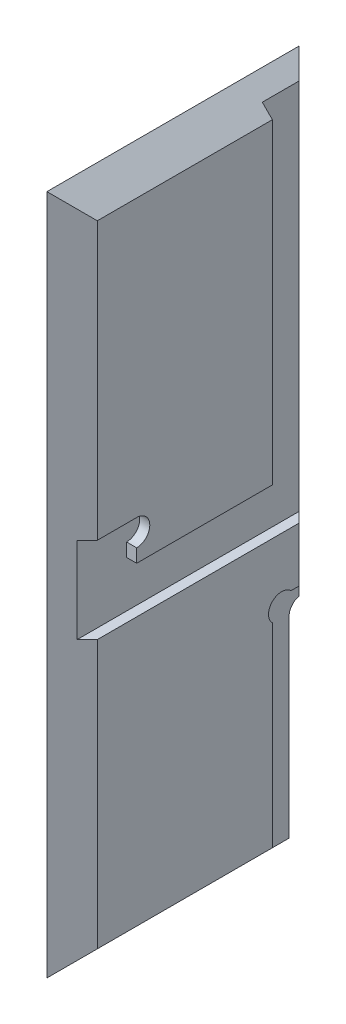
ISO-10303-21;
HEADER;
FILE_DESCRIPTION(('STEP AP214'),'2;1');
FILE_NAME('part.step','',(''),(''),'','','');
FILE_SCHEMA(('AUTOMOTIVE_DESIGN { 1 0 10303 214 1 1 1 1 }'));
ENDSEC;
DATA;
#1=APPLICATION_CONTEXT('core data for automotive mechanical design processes');
#2=APPLICATION_PROTOCOL_DEFINITION('international standard','automotive_design',2000,#1);
#3=PRODUCT_CONTEXT('',#1,'mechanical');
#4=PRODUCT('Part','Part','',(#3));
#5=PRODUCT_RELATED_PRODUCT_CATEGORY('part','',(#4));
#6=PRODUCT_DEFINITION_FORMATION('','',#4);
#7=PRODUCT_DEFINITION_CONTEXT('part definition',#1,'design');
#8=PRODUCT_DEFINITION('design','',#6,#7);
#9=PRODUCT_DEFINITION_SHAPE('','',#8);
#10=(LENGTH_UNIT() NAMED_UNIT(*) SI_UNIT(.MILLI.,.METRE.));
#11=(NAMED_UNIT(*) PLANE_ANGLE_UNIT() SI_UNIT($,.RADIAN.));
#12=(NAMED_UNIT(*) SI_UNIT($,.STERADIAN.) SOLID_ANGLE_UNIT());
#13=UNCERTAINTY_MEASURE_WITH_UNIT(LENGTH_MEASURE(1.E-05),#10,'distance_accuracy_value','');
#14=(GEOMETRIC_REPRESENTATION_CONTEXT(3) GLOBAL_UNCERTAINTY_ASSIGNED_CONTEXT((#13)) GLOBAL_UNIT_ASSIGNED_CONTEXT((#10,
#11,#12)) REPRESENTATION_CONTEXT('',''));
#15=CARTESIAN_POINT('',(0.,0.,0.));
#16=DIRECTION('',(0.,0.,1.));
#17=DIRECTION('',(1.,0.,0.));
#18=AXIS2_PLACEMENT_3D('',#15,#16,#17);
#19=CARTESIAN_POINT('',(0.,171.45,63.4999999999994));
#20=DIRECTION('',(0.707106781186549,0.,0.707106781186546));
#21=DIRECTION('',(0.707106781186546,0.,-0.707106781186549));
#22=AXIS2_PLACEMENT_3D('',#19,#20,#21);
#23=PLANE('',#22);
#24=DIRECTION('',(-0.707106781186546,0.,0.707106781186549));
#25=VECTOR('',#24,1.);
#26=CARTESIAN_POINT('',(0.,-23.876,63.4999999999994));
#27=LINE('',#26,#25);
#28=CARTESIAN_POINT('',(7.62,-23.876,55.8799999999994));
#29=VERTEX_POINT('',#28);
#30=CARTESIAN_POINT('',(12.7,-23.876,50.7999999999994));
#31=VERTEX_POINT('',#30);
#32=EDGE_CURVE('E298',#29,#31,#27,.F.);
#33=ORIENTED_EDGE('',*,*,#32,.F.);
#34=DIRECTION('',(0.,-1.,0.));
#35=VECTOR('',#34,1.);
#36=CARTESIAN_POINT('',(7.62,171.45,55.8799999999994));
#37=LINE('',#36,#35);
#38=CARTESIAN_POINT('',(7.62,19.431,55.8799999999994));
#39=VERTEX_POINT('',#38);
#40=EDGE_CURVE('E300',#29,#39,#37,.F.);
#41=ORIENTED_EDGE('',*,*,#40,.T.);
#42=DIRECTION('',(0.707106781186546,0.,-0.707106781186549));
#43=VECTOR('',#42,1.);
#44=CARTESIAN_POINT('',(0.,19.431,63.4999999999994));
#45=LINE('',#44,#43);
#46=CARTESIAN_POINT('',(12.7,19.431,50.7999999999994));
#47=VERTEX_POINT('',#46);
#48=EDGE_CURVE('E294',#47,#39,#45,.F.);
#49=ORIENTED_EDGE('',*,*,#48,.F.);
#50=DIRECTION('',(0.,1.,0.));
#51=VECTOR('',#50,1.);
#52=CARTESIAN_POINT('',(12.7,171.45,50.7999999999994));
#53=LINE('',#52,#51);
#54=CARTESIAN_POINT('',(12.7,158.75,50.7999999999994));
#55=VERTEX_POINT('',#54);
#56=EDGE_CURVE('E325',#55,#47,#53,.F.);
#57=ORIENTED_EDGE('',*,*,#56,.F.);
#58=DIRECTION('',(-0.577350269189624,0.577350269189627,0.577350269189627));
#59=VECTOR('',#58,1.);
#60=CARTESIAN_POINT('',(0.,171.45,63.4999999999994));
#61=LINE('',#60,#59);
#62=CARTESIAN_POINT('',(0.,171.45,63.4999999999994));
#63=VERTEX_POINT('',#62);
#64=EDGE_CURVE('E317',#55,#63,#61,.T.);
#65=ORIENTED_EDGE('',*,*,#64,.T.);
#66=DIRECTION('',(0.,-1.,0.));
#67=VECTOR('',#66,1.);
#68=CARTESIAN_POINT('',(0.,171.45,63.4999999999994));
#69=LINE('',#68,#67);
#70=CARTESIAN_POINT('',(0.,-171.45,63.4999999999994));
#71=VERTEX_POINT('',#70);
#72=EDGE_CURVE('E303',#63,#71,#69,.T.);
#73=ORIENTED_EDGE('',*,*,#72,.T.);
#74=DIRECTION('',(-0.577350269189624,-0.577350269189627,0.577350269189626));
#75=VECTOR('',#74,1.);
#76=CARTESIAN_POINT('',(0.,-171.45,63.4999999999994));
#77=LINE('',#76,#75);
#78=CARTESIAN_POINT('',(12.7,-158.75,50.7999999999994));
#79=VERTEX_POINT('',#78);
#80=EDGE_CURVE('E208',#79,#71,#77,.T.);
#81=ORIENTED_EDGE('',*,*,#80,.F.);
#82=EDGE_CURVE('E312',#31,#79,#53,.F.);
#83=ORIENTED_EDGE('',*,*,#82,.F.);
#84=EDGE_LOOP('',(#33,#41,#49,#57,#65,#73,#81,#83));
#85=FACE_BOUND('',#84,.T.);
#86=ADVANCED_FACE('F39',(#85),#23,.T.);
#87=CARTESIAN_POINT('',(0.,171.45,-63.4999999999995));
#88=DIRECTION('',(0.707106781186549,0.,-0.707106781186546));
#89=DIRECTION('',(-0.707106781186546,0.,-0.707106781186549));
#90=AXIS2_PLACEMENT_3D('',#87,#88,#89);
#91=PLANE('',#90);
#92=DIRECTION('',(-0.577350269189624,0.577350269189627,-0.577350269189626));
#93=VECTOR('',#92,1.);
#94=CARTESIAN_POINT('',(42.3333333333329,129.116666666667,-21.1666666666665));
#95=LINE('',#94,#93);
#96=CARTESIAN_POINT('',(7.61999999999999,163.83,-55.8799999999995));
#97=VERTEX_POINT('',#96);
#98=CARTESIAN_POINT('',(0.,171.45,-63.4999999999995));
#99=VERTEX_POINT('',#98);
#100=EDGE_CURVE('E315',#97,#99,#95,.T.);
#101=ORIENTED_EDGE('',*,*,#100,.F.);
#102=DIRECTION('',(0.,1.,0.));
#103=VECTOR('',#102,1.);
#104=CARTESIAN_POINT('',(7.62,171.45,-55.8799999999995));
#105=LINE('',#104,#103);
#106=CARTESIAN_POINT('',(7.62,-23.876,-55.8799999999995));
#107=VERTEX_POINT('',#106);
#108=EDGE_CURVE('E196',#97,#107,#105,.F.);
#109=ORIENTED_EDGE('',*,*,#108,.T.);
#110=DIRECTION('',(0.707106781186546,0.,0.707106781186549));
#111=VECTOR('',#110,1.);
#112=CARTESIAN_POINT('',(0.,-23.876,-63.4999999999995));
#113=LINE('',#112,#111);
#114=CARTESIAN_POINT('',(12.7,-23.876,-50.7999999999995));
#115=VERTEX_POINT('',#114);
#116=EDGE_CURVE('E296',#115,#107,#113,.F.);
#117=ORIENTED_EDGE('',*,*,#116,.F.);
#118=DIRECTION('',(0.,-1.,0.));
#119=VECTOR('',#118,1.);
#120=CARTESIAN_POINT('',(12.7,171.45,-50.7999999999995));
#121=LINE('',#120,#119);
#122=CARTESIAN_POINT('',(12.7,-51.3079999999997,-50.7999999999995));
#123=VERTEX_POINT('',#122);
#124=EDGE_CURVE('E324',#123,#115,#121,.F.);
#125=ORIENTED_EDGE('',*,*,#124,.F.);
#126=DIRECTION('',(0.707106781186546,0.,0.707106781186549));
#127=VECTOR('',#126,1.);
#128=CARTESIAN_POINT('',(0.,-51.3079999999997,-63.4999999999995));
#129=LINE('',#128,#127);
#130=CARTESIAN_POINT('',(7.62,-51.3079999999997,-55.8799999999995));
#131=VERTEX_POINT('',#130);
#132=EDGE_CURVE('E273',#123,#131,#129,.F.);
#133=ORIENTED_EDGE('',*,*,#132,.T.);
#134=DIRECTION('',(0.,-1.,0.));
#135=VECTOR('',#134,1.);
#136=CARTESIAN_POINT('',(7.62,171.45,-55.8799999999995));
#137=LINE('',#136,#135);
#138=CARTESIAN_POINT('',(7.62,-60.757251794538,-55.8799999999995));
#139=VERTEX_POINT('',#138);
#140=EDGE_CURVE('E54',#139,#131,#137,.F.);
#141=ORIENTED_EDGE('',*,*,#140,.F.);
#142=CARTESIAN_POINT('',(6.09599999999813,-67.1829999999997,-57.4040000000014));
#143=DIRECTION('',(0.707106781186549,0.,-0.707106781186546));
#144=DIRECTION('',(-0.707106781186546,0.,-0.707106781186549));
#145=AXIS2_PLACEMENT_3D('',#142,#143,#144);
#146=ELLIPSE('',#145,9.3394663659119,6.604);
#147=CARTESIAN_POINT('',(6.09599999999812,-60.5789999999997,-57.4040000000014));
#148=VERTEX_POINT('',#147);
#149=EDGE_CURVE('E47',#139,#148,#146,.F.);
#150=ORIENTED_EDGE('',*,*,#149,.T.);
#151=DIRECTION('',(0.707106781186546,0.,0.707106781186549));
#152=VECTOR('',#151,1.);
#153=CARTESIAN_POINT('',(0.,-60.5789999999997,-63.4999999999995));
#154=LINE('',#153,#152);
#155=CARTESIAN_POINT('',(0.,-60.5789999999997,-63.4999999999996));
#156=VERTEX_POINT('',#155);
#157=EDGE_CURVE('E236',#148,#156,#154,.F.);
#158=ORIENTED_EDGE('',*,*,#157,.T.);
#159=DIRECTION('',(0.,1.,0.));
#160=VECTOR('',#159,1.);
#161=CARTESIAN_POINT('',(0.,171.45,-63.4999999999995));
#162=LINE('',#161,#160);
#163=EDGE_CURVE('E242',#156,#99,#162,.T.);
#164=ORIENTED_EDGE('',*,*,#163,.T.);
#165=EDGE_LOOP('',(#101,#109,#117,#125,#133,#141,#150,#158,#164));
#166=FACE_BOUND('',#165,.T.);
#167=ADVANCED_FACE('F347',(#166),#91,.T.);
#168=CARTESIAN_POINT('',(12.7,0.,0.));
#169=DIRECTION('',(1.,0.,0.));
#170=DIRECTION('',(0.,0.,-1.));
#171=AXIS2_PLACEMENT_3D('',#168,#169,#170);
#172=PLANE('',#171);
#173=DIRECTION('',(0.,-1.,0.));
#174=VECTOR('',#173,1.);
#175=CARTESIAN_POINT('',(12.7,-171.45,-37.3380000000016));
#176=LINE('',#175,#174);
#177=CARTESIAN_POINT('',(12.7,-60.6474663659117,-37.3380000000016));
#178=VERTEX_POINT('',#177);
#179=CARTESIAN_POINT('',(12.7,-158.75,-37.3380000000016));
#180=VERTEX_POINT('',#179);
#181=EDGE_CURVE('E253',#178,#180,#176,.T.);
#182=ORIENTED_EDGE('',*,*,#181,.F.);
#183=CARTESIAN_POINT('',(12.7,-55.9777331829557,-42.0077331829576));
#184=DIRECTION('',(1.,0.,0.));
#185=DIRECTION('',(0.,0.,-1.));
#186=AXIS2_PLACEMENT_3D('',#183,#184,#185);
#187=CIRCLE('',#186,6.604);
#188=CARTESIAN_POINT('',(12.7,-51.3079999999997,-46.6774663659135));
#189=VERTEX_POINT('',#188);
#190=EDGE_CURVE('E257',#189,#178,#187,.T.);
#191=ORIENTED_EDGE('',*,*,#190,.F.);
#192=DIRECTION('',(0.,0.,1.));
#193=VECTOR('',#192,1.);
#194=CARTESIAN_POINT('',(12.7,-51.3079999999997,-46.6774663659135));
#195=LINE('',#194,#193);
#196=EDGE_CURVE('E264',#123,#189,#195,.T.);
#197=ORIENTED_EDGE('',*,*,#196,.F.);
#198=ORIENTED_EDGE('',*,*,#124,.T.);
#199=DIRECTION('',(0.,0.,1.));
#200=VECTOR('',#199,1.);
#201=CARTESIAN_POINT('',(12.7,-23.876,0.));
#202=LINE('',#201,#200);
#203=EDGE_CURVE('E193',#115,#31,#202,.T.);
#204=ORIENTED_EDGE('',*,*,#203,.T.);
#205=ORIENTED_EDGE('',*,*,#82,.T.);
#206=DIRECTION('',(0.,0.,1.));
#207=VECTOR('',#206,1.);
#208=CARTESIAN_POINT('',(12.7,-158.75,63.4999999999994));
#209=LINE('',#208,#207);
#210=EDGE_CURVE('E321',#79,#180,#209,.F.);
#211=ORIENTED_EDGE('',*,*,#210,.T.);
#212=EDGE_LOOP('',(#182,#191,#197,#198,#204,#205,#211));
#213=FACE_BOUND('',#212,.T.);
#214=ADVANCED_FACE('F378',(#213),#172,.T.);
#215=DIRECTION('',(0.,-1.,0.));
#216=VECTOR('',#215,1.);
#217=CARTESIAN_POINT('',(12.7,171.45,-37.3380000000015));
#218=LINE('',#217,#216);
#219=CARTESIAN_POINT('',(12.7,158.75,-37.3380000000015));
#220=VERTEX_POINT('',#219);
#221=CARTESIAN_POINT('',(12.7,-0.508000000000008,-37.3380000000015));
#222=VERTEX_POINT('',#221);
#223=EDGE_CURVE('E166',#220,#222,#218,.T.);
#224=ORIENTED_EDGE('',*,*,#223,.F.);
#225=DIRECTION('',(0.,0.,-1.));
#226=VECTOR('',#225,1.);
#227=CARTESIAN_POINT('',(12.7,158.75,63.4999999999994));
#228=LINE('',#227,#226);
#229=EDGE_CURVE('E320',#220,#55,#228,.F.);
#230=ORIENTED_EDGE('',*,*,#229,.T.);
#231=ORIENTED_EDGE('',*,*,#56,.T.);
#232=DIRECTION('',(0.,0.,-1.));
#233=VECTOR('',#232,1.);
#234=CARTESIAN_POINT('',(12.7,19.431,0.));
#235=LINE('',#234,#233);
#236=CARTESIAN_POINT('',(12.7,19.431,30.9879999999996));
#237=VERTEX_POINT('',#236);
#238=EDGE_CURVE('E198',#47,#237,#235,.T.);
#239=ORIENTED_EDGE('',*,*,#238,.T.);
#240=CARTESIAN_POINT('',(12.7,12.827,30.9879999999996));
#241=DIRECTION('',(1.,0.,0.));
#242=DIRECTION('',(0.,0.,-1.));
#243=AXIS2_PLACEMENT_3D('',#240,#241,#242);
#244=CIRCLE('',#243,6.604);
#245=CARTESIAN_POINT('',(12.7,6.22300000000001,30.9879999999996));
#246=VERTEX_POINT('',#245);
#247=EDGE_CURVE('E205',#246,#237,#244,.T.);
#248=ORIENTED_EDGE('',*,*,#247,.F.);
#249=DIRECTION('',(0.,-1.,0.));
#250=VECTOR('',#249,1.);
#251=CARTESIAN_POINT('',(12.7,0.,30.9879999999996));
#252=LINE('',#251,#250);
#253=CARTESIAN_POINT('',(12.7,-0.508000000000012,30.9879999999996));
#254=VERTEX_POINT('',#253);
#255=EDGE_CURVE('E192',#246,#254,#252,.T.);
#256=ORIENTED_EDGE('',*,*,#255,.T.);
#257=DIRECTION('',(0.,0.,-1.));
#258=VECTOR('',#257,1.);
#259=CARTESIAN_POINT('',(12.7,-0.508000000000008,0.));
#260=LINE('',#259,#258);
#261=EDGE_CURVE('E183',#254,#222,#260,.T.);
#262=ORIENTED_EDGE('',*,*,#261,.T.);
#263=EDGE_LOOP('',(#224,#230,#231,#239,#248,#256,#262));
#264=FACE_BOUND('',#263,.T.);
#265=ADVANCED_FACE('F189',(#264),#172,.T.);
#266=CARTESIAN_POINT('',(0.,-171.45,63.4999999999994));
#267=DIRECTION('',(0.707106781186549,-0.707106781186546,0.));
#268=DIRECTION('',(0.707106781186546,0.707106781186549,0.));
#269=AXIS2_PLACEMENT_3D('',#266,#267,#268);
#270=PLANE('',#269);
#271=DIRECTION('',(0.,0.,-1.));
#272=VECTOR('',#271,1.);
#273=CARTESIAN_POINT('',(0.,-171.45,63.4999999999994));
#274=LINE('',#273,#272);
#275=CARTESIAN_POINT('',(0.,-171.45,-50.8000000000014));
#276=VERTEX_POINT('',#275);
#277=EDGE_CURVE('E306',#71,#276,#274,.T.);
#278=ORIENTED_EDGE('',*,*,#277,.T.);
#279=DIRECTION('',(-0.707106781186546,-0.707106781186549,0.));
#280=VECTOR('',#279,1.);
#281=CARTESIAN_POINT('',(0.,-171.45,-50.8000000000014));
#282=LINE('',#281,#280);
#283=CARTESIAN_POINT('',(7.62,-163.83,-50.8000000000014));
#284=VERTEX_POINT('',#283);
#285=EDGE_CURVE('E250',#276,#284,#282,.F.);
#286=ORIENTED_EDGE('',*,*,#285,.T.);
#287=DIRECTION('',(0.,0.,1.));
#288=VECTOR('',#287,1.);
#289=CARTESIAN_POINT('',(7.62,-163.83,63.4999999999994));
#290=LINE('',#289,#288);
#291=CARTESIAN_POINT('',(7.62,-163.83,-37.3380000000016));
#292=VERTEX_POINT('',#291);
#293=EDGE_CURVE('E204',#292,#284,#290,.F.);
#294=ORIENTED_EDGE('',*,*,#293,.F.);
#295=DIRECTION('',(-0.707106781186546,-0.707106781186549,0.));
#296=VECTOR('',#295,1.);
#297=CARTESIAN_POINT('',(0.,-171.45,-37.3380000000016));
#298=LINE('',#297,#296);
#299=EDGE_CURVE('E211',#292,#180,#298,.F.);
#300=ORIENTED_EDGE('',*,*,#299,.T.);
#301=ORIENTED_EDGE('',*,*,#210,.F.);
#302=ORIENTED_EDGE('',*,*,#80,.T.);
#303=EDGE_LOOP('',(#278,#286,#294,#300,#301,#302));
#304=FACE_BOUND('',#303,.T.);
#305=ADVANCED_FACE('F382',(#304),#270,.T.);
#306=CARTESIAN_POINT('',(0.,171.45,63.4999999999994));
#307=DIRECTION('',(0.707106781186549,0.707106781186546,0.));
#308=DIRECTION('',(-0.707106781186546,0.707106781186549,0.));
#309=AXIS2_PLACEMENT_3D('',#306,#307,#308);
#310=PLANE('',#309);
#311=ORIENTED_EDGE('',*,*,#229,.F.);
#312=DIRECTION('',(0.707106781186546,-0.707106781186549,0.));
#313=VECTOR('',#312,1.);
#314=CARTESIAN_POINT('',(0.,171.45,-37.3380000000015));
#315=LINE('',#314,#313);
#316=CARTESIAN_POINT('',(7.62,163.83,-37.3380000000015));
#317=VERTEX_POINT('',#316);
#318=EDGE_CURVE('E173',#220,#317,#315,.F.);
#319=ORIENTED_EDGE('',*,*,#318,.T.);
#320=DIRECTION('',(0.,0.,1.));
#321=VECTOR('',#320,1.);
#322=CARTESIAN_POINT('',(7.62,163.83,63.4999999999994));
#323=LINE('',#322,#321);
#324=EDGE_CURVE('E186',#317,#97,#323,.F.);
#325=ORIENTED_EDGE('',*,*,#324,.T.);
#326=ORIENTED_EDGE('',*,*,#100,.T.);
#327=DIRECTION('',(0.,0.,1.));
#328=VECTOR('',#327,1.);
#329=CARTESIAN_POINT('',(0.,171.45,63.4999999999994));
#330=LINE('',#329,#328);
#331=EDGE_CURVE('E310',#99,#63,#330,.T.);
#332=ORIENTED_EDGE('',*,*,#331,.T.);
#333=ORIENTED_EDGE('',*,*,#64,.F.);
#334=EDGE_LOOP('',(#311,#319,#325,#326,#332,#333));
#335=FACE_BOUND('',#334,.T.);
#336=ADVANCED_FACE('F350',(#335),#310,.T.);
#337=CARTESIAN_POINT('',(0.,0.,0.));
#338=DIRECTION('',(1.,0.,0.));
#339=DIRECTION('',(0.,0.,-1.));
#340=AXIS2_PLACEMENT_3D('',#337,#338,#339);
#341=PLANE('',#340);
#342=DIRECTION('',(0.,0.,1.));
#343=VECTOR('',#342,1.);
#344=CARTESIAN_POINT('',(0.,-60.5789999999997,-63.4999999999996));
#345=LINE('',#344,#343);
#346=CARTESIAN_POINT('',(0.,-60.5789999999997,-57.4040000000014));
#347=VERTEX_POINT('',#346);
#348=EDGE_CURVE('E234',#156,#347,#345,.T.);
#349=ORIENTED_EDGE('',*,*,#348,.T.);
#350=CARTESIAN_POINT('',(0.,-67.1829999999997,-57.4040000000014));
#351=DIRECTION('',(1.,0.,0.));
#352=DIRECTION('',(0.,0.,-1.));
#353=AXIS2_PLACEMENT_3D('',#350,#351,#352);
#354=CIRCLE('',#353,6.604);
#355=CARTESIAN_POINT('',(0.,-67.1829999999997,-50.8000000000014));
#356=VERTEX_POINT('',#355);
#357=EDGE_CURVE('E11',#347,#356,#354,.T.);
#358=ORIENTED_EDGE('',*,*,#357,.T.);
#359=DIRECTION('',(0.,-1.,0.));
#360=VECTOR('',#359,1.);
#361=CARTESIAN_POINT('',(0.,-171.45,-50.8000000000014));
#362=LINE('',#361,#360);
#363=EDGE_CURVE('E243',#356,#276,#362,.T.);
#364=ORIENTED_EDGE('',*,*,#363,.T.);
#365=ORIENTED_EDGE('',*,*,#277,.F.);
#366=ORIENTED_EDGE('',*,*,#72,.F.);
#367=ORIENTED_EDGE('',*,*,#331,.F.);
#368=ORIENTED_EDGE('',*,*,#163,.F.);
#369=EDGE_LOOP('',(#349,#358,#364,#365,#366,#367,#368));
#370=FACE_BOUND('',#369,.T.);
#371=ADVANCED_FACE('F238',(#370),#341,.F.);
#372=CARTESIAN_POINT('',(7.62,12.827,30.9879999999996));
#373=DIRECTION('',(-1.,0.,0.));
#374=DIRECTION('',(0.,0.,1.));
#375=AXIS2_PLACEMENT_3D('',#372,#373,#374);
#376=PLANE('',#375);
#377=DIRECTION('',(0.,0.,-1.));
#378=VECTOR('',#377,1.);
#379=CARTESIAN_POINT('',(7.62,-23.876,63.4999999999994));
#380=LINE('',#379,#378);
#381=EDGE_CURVE('E275',#29,#107,#380,.T.);
#382=ORIENTED_EDGE('',*,*,#381,.T.);
#383=ORIENTED_EDGE('',*,*,#108,.F.);
#384=ORIENTED_EDGE('',*,*,#324,.F.);
#385=DIRECTION('',(0.,-1.,0.));
#386=VECTOR('',#385,1.);
#387=CARTESIAN_POINT('',(7.62,171.45,-37.3380000000015));
#388=LINE('',#387,#386);
#389=CARTESIAN_POINT('',(7.62,-0.508000000000003,-37.3380000000015));
#390=VERTEX_POINT('',#389);
#391=EDGE_CURVE('E177',#317,#390,#388,.T.);
#392=ORIENTED_EDGE('',*,*,#391,.T.);
#393=DIRECTION('',(0.,0.,1.));
#394=VECTOR('',#393,1.);
#395=CARTESIAN_POINT('',(7.62,-0.508,-63.4999999999996));
#396=LINE('',#395,#394);
#397=CARTESIAN_POINT('',(7.62,-0.508000000000012,30.9879999999996));
#398=VERTEX_POINT('',#397);
#399=EDGE_CURVE('E185',#390,#398,#396,.T.);
#400=ORIENTED_EDGE('',*,*,#399,.T.);
#401=DIRECTION('',(0.,1.,0.));
#402=VECTOR('',#401,1.);
#403=CARTESIAN_POINT('',(7.62,6.22300000000001,30.9879999999996));
#404=LINE('',#403,#402);
#405=CARTESIAN_POINT('',(7.62,6.22300000000001,30.9879999999996));
#406=VERTEX_POINT('',#405);
#407=EDGE_CURVE('E279',#398,#406,#404,.T.);
#408=ORIENTED_EDGE('',*,*,#407,.T.);
#409=CARTESIAN_POINT('',(7.62,12.827,30.9879999999996));
#410=DIRECTION('',(1.,0.,0.));
#411=DIRECTION('',(0.,0.,1.));
#412=AXIS2_PLACEMENT_3D('',#409,#410,#411);
#413=CIRCLE('',#412,6.604);
#414=CARTESIAN_POINT('',(7.62,19.431,30.9879999999996));
#415=VERTEX_POINT('',#414);
#416=EDGE_CURVE('E282',#406,#415,#413,.T.);
#417=ORIENTED_EDGE('',*,*,#416,.T.);
#418=DIRECTION('',(0.,0.,1.));
#419=VECTOR('',#418,1.);
#420=CARTESIAN_POINT('',(7.62,19.431,63.4999999999994));
#421=LINE('',#420,#419);
#422=EDGE_CURVE('E285',#415,#39,#421,.T.);
#423=ORIENTED_EDGE('',*,*,#422,.T.);
#424=ORIENTED_EDGE('',*,*,#40,.F.);
#425=EDGE_LOOP('',(#382,#383,#384,#392,#400,#408,#417,#423,#424));
#426=FACE_BOUND('',#425,.T.);
#427=ADVANCED_FACE('F340',(#426),#376,.F.);
#428=CARTESIAN_POINT('',(12.700012,-23.876,63.4999999999994));
#429=DIRECTION('',(0.,1.,0.));
#430=DIRECTION('',(0.,0.,1.));
#431=AXIS2_PLACEMENT_3D('',#428,#429,#430);
#432=PLANE('',#431);
#433=ORIENTED_EDGE('',*,*,#32,.T.);
#434=ORIENTED_EDGE('',*,*,#203,.F.);
#435=ORIENTED_EDGE('',*,*,#116,.T.);
#436=ORIENTED_EDGE('',*,*,#381,.F.);
#437=EDGE_LOOP('',(#433,#434,#435,#436));
#438=FACE_BOUND('',#437,.T.);
#439=ADVANCED_FACE('F342',(#438),#432,.T.);
#440=CARTESIAN_POINT('',(12.700012,-0.508,-63.4999999999996));
#441=DIRECTION('',(0.,-1.,0.));
#442=DIRECTION('',(0.,0.,-1.));
#443=AXIS2_PLACEMENT_3D('',#440,#441,#442);
#444=PLANE('',#443);
#445=DIRECTION('',(1.,0.,0.));
#446=VECTOR('',#445,1.);
#447=CARTESIAN_POINT('',(7.62,-0.508000000000008,-37.3380000000015));
#448=LINE('',#447,#446);
#449=EDGE_CURVE('E170',#390,#222,#448,.T.);
#450=ORIENTED_EDGE('',*,*,#449,.T.);
#451=ORIENTED_EDGE('',*,*,#261,.F.);
#452=DIRECTION('',(-1.,0.,0.));
#453=VECTOR('',#452,1.);
#454=CARTESIAN_POINT('',(12.700012,-0.508000000000012,30.9879999999996));
#455=LINE('',#454,#453);
#456=EDGE_CURVE('E292',#254,#398,#455,.T.);
#457=ORIENTED_EDGE('',*,*,#456,.T.);
#458=ORIENTED_EDGE('',*,*,#399,.F.);
#459=EDGE_LOOP('',(#450,#451,#457,#458));
#460=FACE_BOUND('',#459,.T.);
#461=ADVANCED_FACE('F181',(#460),#444,.T.);
#462=CARTESIAN_POINT('',(12.700012,19.431,63.4999999999994));
#463=DIRECTION('',(0.,-1.,0.));
#464=DIRECTION('',(0.,0.,-1.));
#465=AXIS2_PLACEMENT_3D('',#462,#463,#464);
#466=PLANE('',#465);
#467=ORIENTED_EDGE('',*,*,#48,.T.);
#468=ORIENTED_EDGE('',*,*,#422,.F.);
#469=DIRECTION('',(1.,0.,0.));
#470=VECTOR('',#469,1.);
#471=CARTESIAN_POINT('',(7.62,19.431,30.9879999999996));
#472=LINE('',#471,#470);
#473=EDGE_CURVE('E290',#415,#237,#472,.T.);
#474=ORIENTED_EDGE('',*,*,#473,.T.);
#475=ORIENTED_EDGE('',*,*,#238,.F.);
#476=EDGE_LOOP('',(#467,#468,#474,#475));
#477=FACE_BOUND('',#476,.T.);
#478=ADVANCED_FACE('F333',(#477),#466,.T.);
#479=CARTESIAN_POINT('',(12.700012,6.22300000000001,30.9879999999996));
#480=DIRECTION('',(0.,0.,1.));
#481=DIRECTION('',(1.,0.,0.));
#482=AXIS2_PLACEMENT_3D('',#479,#480,#481);
#483=PLANE('',#482);
#484=DIRECTION('',(1.,0.,0.));
#485=VECTOR('',#484,1.);
#486=CARTESIAN_POINT('',(7.62,6.22300000000001,30.9879999999996));
#487=LINE('',#486,#485);
#488=EDGE_CURVE('E288',#406,#246,#487,.T.);
#489=ORIENTED_EDGE('',*,*,#488,.F.);
#490=ORIENTED_EDGE('',*,*,#407,.F.);
#491=ORIENTED_EDGE('',*,*,#456,.F.);
#492=ORIENTED_EDGE('',*,*,#255,.F.);
#493=EDGE_LOOP('',(#489,#490,#491,#492));
#494=FACE_BOUND('',#493,.T.);
#495=ADVANCED_FACE('F354',(#494),#483,.T.);
#496=CARTESIAN_POINT('',(7.62,12.827,30.9879999999996));
#497=DIRECTION('',(1.,0.,0.));
#498=DIRECTION('',(0.,0.,-1.));
#499=AXIS2_PLACEMENT_3D('',#496,#497,#498);
#500=CYLINDRICAL_SURFACE('',#499,6.604);
#501=ORIENTED_EDGE('',*,*,#247,.T.);
#502=ORIENTED_EDGE('',*,*,#473,.F.);
#503=ORIENTED_EDGE('',*,*,#416,.F.);
#504=ORIENTED_EDGE('',*,*,#488,.T.);
#505=EDGE_LOOP('',(#501,#502,#503,#504));
#506=FACE_BOUND('',#505,.T.);
#507=ADVANCED_FACE('F357',(#506),#500,.F.);
#508=CARTESIAN_POINT('',(7.62,-51.3079999999997,-46.6774663659135));
#509=DIRECTION('',(0.,1.,0.));
#510=DIRECTION('',(0.,0.,1.));
#511=AXIS2_PLACEMENT_3D('',#508,#509,#510);
#512=PLANE('',#511);
#513=ORIENTED_EDGE('',*,*,#196,.T.);
#514=DIRECTION('',(1.,0.,0.));
#515=VECTOR('',#514,1.);
#516=CARTESIAN_POINT('',(7.62,-51.3079999999997,-46.6774663659135));
#517=LINE('',#516,#515);
#518=CARTESIAN_POINT('',(7.62,-51.3079999999997,-46.6774663659135));
#519=VERTEX_POINT('',#518);
#520=EDGE_CURVE('E262',#519,#189,#517,.T.);
#521=ORIENTED_EDGE('',*,*,#520,.F.);
#522=DIRECTION('',(0.,0.,1.));
#523=VECTOR('',#522,1.);
#524=CARTESIAN_POINT('',(7.62,-51.3079999999997,-46.6774663659135));
#525=LINE('',#524,#523);
#526=EDGE_CURVE('E256',#131,#519,#525,.T.);
#527=ORIENTED_EDGE('',*,*,#526,.F.);
#528=ORIENTED_EDGE('',*,*,#132,.F.);
#529=EDGE_LOOP('',(#513,#521,#527,#528));
#530=FACE_BOUND('',#529,.T.);
#531=ADVANCED_FACE('F359',(#530),#512,.F.);
#532=CARTESIAN_POINT('',(7.62,-171.45,-37.3380000000016));
#533=DIRECTION('',(0.,0.,1.));
#534=DIRECTION('',(1.,0.,0.));
#535=AXIS2_PLACEMENT_3D('',#532,#533,#534);
#536=PLANE('',#535);
#537=DIRECTION('',(0.,-1.,0.));
#538=VECTOR('',#537,1.);
#539=CARTESIAN_POINT('',(7.62,-171.45,-37.3380000000016));
#540=LINE('',#539,#538);
#541=CARTESIAN_POINT('',(7.62,-60.6474663659117,-37.3380000000016));
#542=VERTEX_POINT('',#541);
#543=EDGE_CURVE('E254',#542,#292,#540,.T.);
#544=ORIENTED_EDGE('',*,*,#543,.F.);
#545=DIRECTION('',(1.,0.,0.));
#546=VECTOR('',#545,1.);
#547=CARTESIAN_POINT('',(7.62,-60.6474663659117,-37.3380000000016));
#548=LINE('',#547,#546);
#549=EDGE_CURVE('E268',#542,#178,#548,.T.);
#550=ORIENTED_EDGE('',*,*,#549,.T.);
#551=ORIENTED_EDGE('',*,*,#181,.T.);
#552=ORIENTED_EDGE('',*,*,#299,.F.);
#553=EDGE_LOOP('',(#544,#550,#551,#552));
#554=FACE_BOUND('',#553,.T.);
#555=ADVANCED_FACE('F366',(#554),#536,.F.);
#556=CARTESIAN_POINT('',(7.62,-55.9777331829557,-42.0077331829576));
#557=DIRECTION('',(1.,0.,0.));
#558=DIRECTION('',(0.,0.,-1.));
#559=AXIS2_PLACEMENT_3D('',#556,#557,#558);
#560=PLANE('',#559);
#561=DIRECTION('',(0.,-1.,0.));
#562=VECTOR('',#561,1.);
#563=CARTESIAN_POINT('',(7.62,-55.9777331829557,-50.8000000000014));
#564=LINE('',#563,#562);
#565=CARTESIAN_POINT('',(7.62,-67.1829999999997,-50.8000000000014));
#566=VERTEX_POINT('',#565);
#567=EDGE_CURVE('E214',#566,#284,#564,.T.);
#568=ORIENTED_EDGE('',*,*,#567,.F.);
#569=CARTESIAN_POINT('',(7.62,-67.1829999999997,-57.4040000000014));
#570=DIRECTION('',(1.,0.,0.));
#571=DIRECTION('',(0.,0.,-1.));
#572=AXIS2_PLACEMENT_3D('',#569,#570,#571);
#573=CIRCLE('',#572,6.604);
#574=EDGE_CURVE('E221',#566,#139,#573,.F.);
#575=ORIENTED_EDGE('',*,*,#574,.T.);
#576=ORIENTED_EDGE('',*,*,#140,.T.);
#577=ORIENTED_EDGE('',*,*,#526,.T.);
#578=CARTESIAN_POINT('',(7.62,-55.9777331829557,-42.0077331829576));
#579=DIRECTION('',(1.,0.,0.));
#580=DIRECTION('',(0.,0.,-1.));
#581=AXIS2_PLACEMENT_3D('',#578,#579,#580);
#582=CIRCLE('',#581,6.604);
#583=EDGE_CURVE('E259',#519,#542,#582,.T.);
#584=ORIENTED_EDGE('',*,*,#583,.T.);
#585=ORIENTED_EDGE('',*,*,#543,.T.);
#586=ORIENTED_EDGE('',*,*,#293,.T.);
#587=EDGE_LOOP('',(#568,#575,#576,#577,#584,#585,#586));
#588=FACE_BOUND('',#587,.T.);
#589=ADVANCED_FACE('F224',(#588),#560,.T.);
#590=CARTESIAN_POINT('',(7.62,-55.9777331829557,-42.0077331829576));
#591=DIRECTION('',(1.,0.,0.));
#592=DIRECTION('',(0.,0.,-1.));
#593=AXIS2_PLACEMENT_3D('',#590,#591,#592);
#594=CYLINDRICAL_SURFACE('',#593,6.604);
#595=ORIENTED_EDGE('',*,*,#190,.T.);
#596=ORIENTED_EDGE('',*,*,#549,.F.);
#597=ORIENTED_EDGE('',*,*,#583,.F.);
#598=ORIENTED_EDGE('',*,*,#520,.T.);
#599=EDGE_LOOP('',(#595,#596,#597,#598));
#600=FACE_BOUND('',#599,.T.);
#601=ADVANCED_FACE('F439',(#600),#594,.F.);
#602=CARTESIAN_POINT('',(0.,-171.45,-50.8000000000014));
#603=DIRECTION('',(0.,0.,1.));
#604=DIRECTION('',(1.,0.,0.));
#605=AXIS2_PLACEMENT_3D('',#602,#603,#604);
#606=PLANE('',#605);
#607=ORIENTED_EDGE('',*,*,#363,.F.);
#608=DIRECTION('',(1.,0.,0.));
#609=VECTOR('',#608,1.);
#610=CARTESIAN_POINT('',(7.62,-67.1829999999997,-50.8000000000014));
#611=LINE('',#610,#609);
#612=EDGE_CURVE('E216',#356,#566,#611,.T.);
#613=ORIENTED_EDGE('',*,*,#612,.T.);
#614=ORIENTED_EDGE('',*,*,#567,.T.);
#615=ORIENTED_EDGE('',*,*,#285,.F.);
#616=EDGE_LOOP('',(#607,#613,#614,#615));
#617=FACE_BOUND('',#616,.T.);
#618=ADVANCED_FACE('F448',(#617),#606,.F.);
#619=CARTESIAN_POINT('',(0.,-60.5789999999997,-63.4999999999996));
#620=DIRECTION('',(0.,1.,0.));
#621=DIRECTION('',(0.,0.,1.));
#622=AXIS2_PLACEMENT_3D('',#619,#620,#621);
#623=PLANE('',#622);
#624=ORIENTED_EDGE('',*,*,#157,.F.);
#625=DIRECTION('',(1.,0.,0.));
#626=VECTOR('',#625,1.);
#627=CARTESIAN_POINT('',(0.,-60.5789999999997,-57.4040000000014));
#628=LINE('',#627,#626);
#629=EDGE_CURVE('E219',#148,#347,#628,.F.);
#630=ORIENTED_EDGE('',*,*,#629,.T.);
#631=ORIENTED_EDGE('',*,*,#348,.F.);
#632=EDGE_LOOP('',(#624,#630,#631));
#633=FACE_BOUND('',#632,.T.);
#634=ADVANCED_FACE('F233',(#633),#623,.F.);
#635=CARTESIAN_POINT('',(7.62,171.45,-37.3380000000015));
#636=DIRECTION('',(0.,0.,1.));
#637=DIRECTION('',(1.,0.,0.));
#638=AXIS2_PLACEMENT_3D('',#635,#636,#637);
#639=PLANE('',#638);
#640=ORIENTED_EDGE('',*,*,#223,.T.);
#641=ORIENTED_EDGE('',*,*,#449,.F.);
#642=ORIENTED_EDGE('',*,*,#391,.F.);
#643=ORIENTED_EDGE('',*,*,#318,.F.);
#644=EDGE_LOOP('',(#640,#641,#642,#643));
#645=FACE_BOUND('',#644,.T.);
#646=ADVANCED_FACE('F168',(#645),#639,.F.);
#647=CARTESIAN_POINT('',(0.,-67.1829999999997,-57.4040000000014));
#648=DIRECTION('',(-1.,0.,0.));
#649=DIRECTION('',(0.,0.,1.));
#650=AXIS2_PLACEMENT_3D('',#647,#648,#649);
#651=CYLINDRICAL_SURFACE('',#650,6.604);
#652=ORIENTED_EDGE('',*,*,#357,.F.);
#653=ORIENTED_EDGE('',*,*,#629,.F.);
#654=ORIENTED_EDGE('',*,*,#149,.F.);
#655=ORIENTED_EDGE('',*,*,#574,.F.);
#656=ORIENTED_EDGE('',*,*,#612,.F.);
#657=EDGE_LOOP('',(#652,#653,#654,#655,#656));
#658=FACE_BOUND('',#657,.T.);
#659=ADVANCED_FACE('F41',(#658),#651,.F.);
#660=CLOSED_SHELL('',(#86,#167,#214,#265,#305,#336,#371,#427,#439,#461,#478,#495,#507,#531,#555,
#589,#601,#618,#634,#646,#659));
#661=MANIFOLD_SOLID_BREP('B2',#660);
#662=ADVANCED_BREP_SHAPE_REPRESENTATION('',(#18,#661),#14);
#663=SHAPE_DEFINITION_REPRESENTATION(#9,#662);
ENDSEC;
END-ISO-10303-21;
